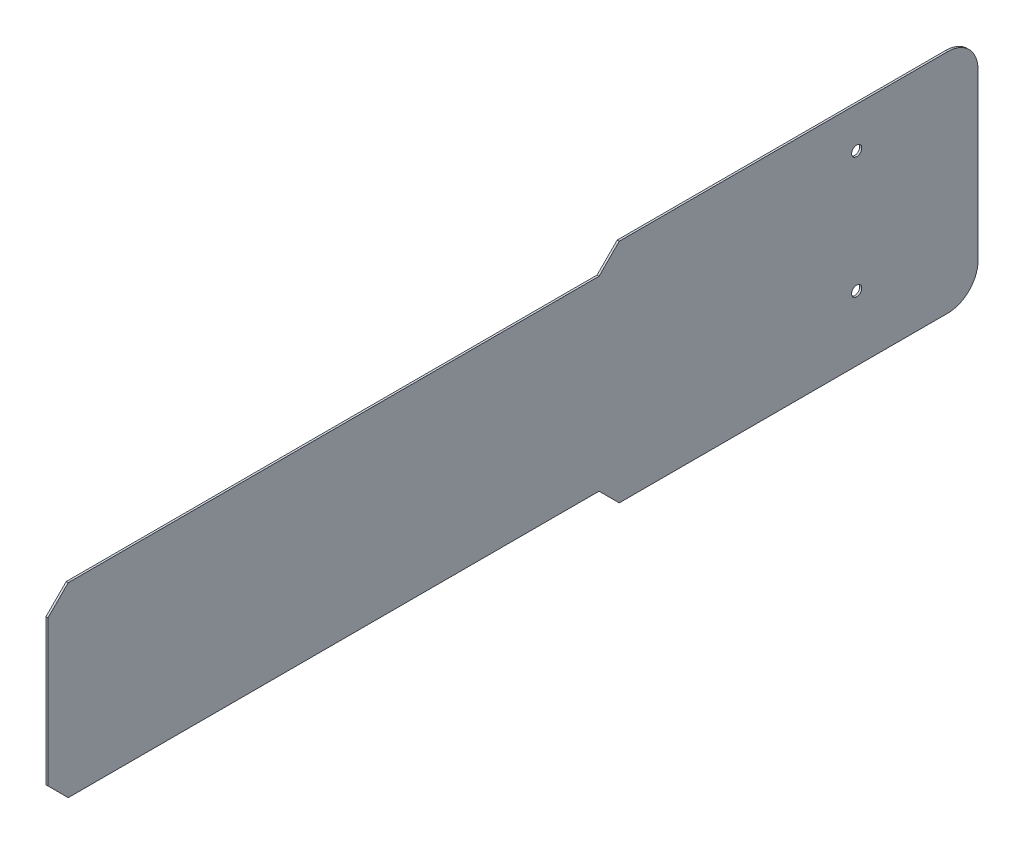
ISO-10303-21;
HEADER;
FILE_DESCRIPTION(('STEP AP214'),'2;1');
FILE_NAME('part.step','',(''),(''),'','','');
FILE_SCHEMA(('AUTOMOTIVE_DESIGN { 1 0 10303 214 1 1 1 1 }'));
ENDSEC;
DATA;
#1=APPLICATION_CONTEXT('core data for automotive mechanical design processes');
#2=APPLICATION_PROTOCOL_DEFINITION('international standard','automotive_design',2000,#1);
#3=PRODUCT_CONTEXT('',#1,'mechanical');
#4=PRODUCT('Part','Part','',(#3));
#5=PRODUCT_RELATED_PRODUCT_CATEGORY('part','',(#4));
#6=PRODUCT_DEFINITION_FORMATION('','',#4);
#7=PRODUCT_DEFINITION_CONTEXT('part definition',#1,'design');
#8=PRODUCT_DEFINITION('design','',#6,#7);
#9=PRODUCT_DEFINITION_SHAPE('','',#8);
#10=(LENGTH_UNIT() NAMED_UNIT(*) SI_UNIT(.MILLI.,.METRE.));
#11=(NAMED_UNIT(*) PLANE_ANGLE_UNIT() SI_UNIT($,.RADIAN.));
#12=(NAMED_UNIT(*) SI_UNIT($,.STERADIAN.) SOLID_ANGLE_UNIT());
#13=UNCERTAINTY_MEASURE_WITH_UNIT(LENGTH_MEASURE(1.E-05),#10,'distance_accuracy_value','');
#14=(GEOMETRIC_REPRESENTATION_CONTEXT(3) GLOBAL_UNCERTAINTY_ASSIGNED_CONTEXT((#13)) GLOBAL_UNIT_ASSIGNED_CONTEXT((#10,
#11,#12)) REPRESENTATION_CONTEXT('',''));
#15=CARTESIAN_POINT('',(0.,0.,0.));
#16=DIRECTION('',(0.,0.,1.));
#17=DIRECTION('',(1.,0.,0.));
#18=AXIS2_PLACEMENT_3D('',#15,#16,#17);
#19=CARTESIAN_POINT('',(-0.2,-35.603076923077,-25.6615384615385));
#20=DIRECTION('',(1.,0.,0.));
#21=DIRECTION('',(0.,0.,-1.));
#22=AXIS2_PLACEMENT_3D('',#19,#20,#21);
#23=CYLINDRICAL_SURFACE('',#22,3.);
#24=DIRECTION('',(1.,0.,0.));
#25=VECTOR('',#24,1.);
#26=CARTESIAN_POINT('',(-0.2,-35.603076923077,-28.6615384615385));
#27=LINE('',#26,#25);
#28=CARTESIAN_POINT('',(-0.2,-35.603076923077,-28.6615384615385));
#29=VERTEX_POINT('',#28);
#30=CARTESIAN_POINT('',(0.,-35.603076923077,-28.6615384615385));
#31=VERTEX_POINT('',#30);
#32=EDGE_CURVE('E192',#29,#31,#27,.T.);
#33=ORIENTED_EDGE('',*,*,#32,.F.);
#34=CARTESIAN_POINT('',(-0.2,-35.603076923077,-25.6615384615385));
#35=DIRECTION('',(1.,0.,0.));
#36=DIRECTION('',(0.,0.,-1.));
#37=AXIS2_PLACEMENT_3D('',#34,#35,#36);
#38=CIRCLE('',#37,3.);
#39=CARTESIAN_POINT('',(-0.2,-32.603076923077,-25.6615384615385));
#40=VERTEX_POINT('',#39);
#41=EDGE_CURVE('E42',#40,#29,#38,.F.);
#42=ORIENTED_EDGE('',*,*,#41,.F.);
#43=DIRECTION('',(1.,0.,0.));
#44=VECTOR('',#43,1.);
#45=CARTESIAN_POINT('',(-0.2,-32.603076923077,-25.6615384615385));
#46=LINE('',#45,#44);
#47=CARTESIAN_POINT('',(0.,-32.603076923077,-25.6615384615385));
#48=VERTEX_POINT('',#47);
#49=EDGE_CURVE('E195',#48,#40,#46,.F.);
#50=ORIENTED_EDGE('',*,*,#49,.F.);
#51=CARTESIAN_POINT('',(0.,-35.603076923077,-25.6615384615385));
#52=DIRECTION('',(1.,0.,0.));
#53=DIRECTION('',(0.,0.,-1.));
#54=AXIS2_PLACEMENT_3D('',#51,#52,#53);
#55=CIRCLE('',#54,3.);
#56=EDGE_CURVE('E11',#31,#48,#55,.T.);
#57=ORIENTED_EDGE('',*,*,#56,.F.);
#58=EDGE_LOOP('',(#33,#42,#50,#57));
#59=FACE_BOUND('',#58,.T.);
#60=ADVANCED_FACE('F34',(#59),#23,.T.);
#61=CARTESIAN_POINT('',(-0.2,-52.0230769230769,-25.6615384615385));
#62=DIRECTION('',(1.,0.,0.));
#63=DIRECTION('',(0.,0.,-1.));
#64=AXIS2_PLACEMENT_3D('',#61,#62,#63);
#65=CYLINDRICAL_SURFACE('',#64,3.);
#66=DIRECTION('',(-1.,0.,0.));
#67=VECTOR('',#66,1.);
#68=CARTESIAN_POINT('',(-0.2,-52.0230769230769,-28.6615384615385));
#69=LINE('',#68,#67);
#70=CARTESIAN_POINT('',(0.,-52.0230769230769,-28.6615384615385));
#71=VERTEX_POINT('',#70);
#72=CARTESIAN_POINT('',(-0.2,-52.0230769230769,-28.6615384615385));
#73=VERTEX_POINT('',#72);
#74=EDGE_CURVE('E174',#71,#73,#69,.T.);
#75=ORIENTED_EDGE('',*,*,#74,.F.);
#76=CARTESIAN_POINT('',(0.,-52.0230769230769,-25.6615384615385));
#77=DIRECTION('',(1.,0.,0.));
#78=DIRECTION('',(0.,0.,-1.));
#79=AXIS2_PLACEMENT_3D('',#76,#77,#78);
#80=CIRCLE('',#79,3.);
#81=CARTESIAN_POINT('',(0.,-55.0230769230769,-25.6615384615385));
#82=VERTEX_POINT('',#81);
#83=EDGE_CURVE('E188',#82,#71,#80,.T.);
#84=ORIENTED_EDGE('',*,*,#83,.F.);
#85=DIRECTION('',(-1.,0.,0.));
#86=VECTOR('',#85,1.);
#87=CARTESIAN_POINT('',(-0.2,-55.0230769230769,-25.6615384615385));
#88=LINE('',#87,#86);
#89=CARTESIAN_POINT('',(-0.2,-55.0230769230769,-25.6615384615385));
#90=VERTEX_POINT('',#89);
#91=EDGE_CURVE('E185',#90,#82,#88,.F.);
#92=ORIENTED_EDGE('',*,*,#91,.F.);
#93=CARTESIAN_POINT('',(-0.2,-52.0230769230769,-25.6615384615385));
#94=DIRECTION('',(1.,0.,0.));
#95=DIRECTION('',(0.,0.,-1.));
#96=AXIS2_PLACEMENT_3D('',#93,#94,#95);
#97=CIRCLE('',#96,3.);
#98=EDGE_CURVE('E190',#73,#90,#97,.F.);
#99=ORIENTED_EDGE('',*,*,#98,.F.);
#100=EDGE_LOOP('',(#75,#84,#92,#99));
#101=FACE_BOUND('',#100,.T.);
#102=ADVANCED_FACE('F210',(#101),#65,.T.);
#103=CARTESIAN_POINT('',(-0.2,-55.0230769230769,-28.6615384615385));
#104=DIRECTION('',(0.,0.,-1.));
#105=DIRECTION('',(-1.,0.,0.));
#106=AXIS2_PLACEMENT_3D('',#103,#104,#105);
#107=PLANE('',#106);
#108=DIRECTION('',(0.,1.,0.));
#109=VECTOR('',#108,1.);
#110=CARTESIAN_POINT('',(-0.2,-55.0230769230769,-28.6615384615385));
#111=LINE('',#110,#109);
#112=EDGE_CURVE('E161',#73,#29,#111,.T.);
#113=ORIENTED_EDGE('',*,*,#112,.T.);
#114=ORIENTED_EDGE('',*,*,#32,.T.);
#115=DIRECTION('',(0.,1.,0.));
#116=VECTOR('',#115,1.);
#117=CARTESIAN_POINT('',(0.,-55.0230769230769,-28.6615384615385));
#118=LINE('',#117,#116);
#119=EDGE_CURVE('E160',#71,#31,#118,.T.);
#120=ORIENTED_EDGE('',*,*,#119,.F.);
#121=ORIENTED_EDGE('',*,*,#74,.T.);
#122=EDGE_LOOP('',(#113,#114,#120,#121));
#123=FACE_BOUND('',#122,.T.);
#124=ADVANCED_FACE('F207',(#123),#107,.T.);
#125=CARTESIAN_POINT('',(-0.2,-55.0230769230769,-28.6615384615385));
#126=DIRECTION('',(0.,1.,0.));
#127=DIRECTION('',(0.,0.,1.));
#128=AXIS2_PLACEMENT_3D('',#125,#126,#127);
#129=PLANE('',#128);
#130=DIRECTION('',(0.,0.,1.));
#131=VECTOR('',#130,1.);
#132=CARTESIAN_POINT('',(0.,-55.0230769230769,-28.6615384615385));
#133=LINE('',#132,#131);
#134=CARTESIAN_POINT('',(0.,-55.0230769230769,6.82846153846155));
#135=VERTEX_POINT('',#134);
#136=EDGE_CURVE('E165',#82,#135,#133,.T.);
#137=ORIENTED_EDGE('',*,*,#136,.T.);
#138=DIRECTION('',(-1.,0.,0.));
#139=VECTOR('',#138,1.);
#140=CARTESIAN_POINT('',(0.,-55.0230769230769,6.82846153846155));
#141=LINE('',#140,#139);
#142=CARTESIAN_POINT('',(-0.200000000000003,-55.0230769230769,6.82846153846155));
#143=VERTEX_POINT('',#142);
#144=EDGE_CURVE('E220',#135,#143,#141,.T.);
#145=ORIENTED_EDGE('',*,*,#144,.T.);
#146=DIRECTION('',(0.,0.,1.));
#147=VECTOR('',#146,1.);
#148=CARTESIAN_POINT('',(-0.2,-55.0230769230769,-28.6615384615385));
#149=LINE('',#148,#147);
#150=EDGE_CURVE('E171',#90,#143,#149,.T.);
#151=ORIENTED_EDGE('',*,*,#150,.F.);
#152=ORIENTED_EDGE('',*,*,#91,.T.);
#153=EDGE_LOOP('',(#137,#145,#151,#152));
#154=FACE_BOUND('',#153,.T.);
#155=ADVANCED_FACE('F218',(#154),#129,.F.);
#156=CARTESIAN_POINT('',(-0.2,-55.0230769230769,63.3384615384615));
#157=DIRECTION('',(0.,0.,-1.));
#158=DIRECTION('',(-1.,0.,0.));
#159=AXIS2_PLACEMENT_3D('',#156,#157,#158);
#160=PLANE('',#159);
#161=DIRECTION('',(0.,1.,0.));
#162=VECTOR('',#161,1.);
#163=CARTESIAN_POINT('',(0.,-55.0230769230769,63.3384615384615));
#164=LINE('',#163,#162);
#165=CARTESIAN_POINT('',(0.,-51.0230769230769,63.3384615384615));
#166=VERTEX_POINT('',#165);
#167=CARTESIAN_POINT('',(0.,-36.603076923077,63.3384615384615));
#168=VERTEX_POINT('',#167);
#169=EDGE_CURVE('E178',#166,#168,#164,.T.);
#170=ORIENTED_EDGE('',*,*,#169,.T.);
#171=DIRECTION('',(-1.,0.,0.));
#172=VECTOR('',#171,1.);
#173=CARTESIAN_POINT('',(0.,-36.603076923077,63.3384615384615));
#174=LINE('',#173,#172);
#175=CARTESIAN_POINT('',(-0.200000000000002,-36.603076923077,63.3384615384615));
#176=VERTEX_POINT('',#175);
#177=EDGE_CURVE('E231',#168,#176,#174,.T.);
#178=ORIENTED_EDGE('',*,*,#177,.T.);
#179=DIRECTION('',(0.,1.,0.));
#180=VECTOR('',#179,1.);
#181=CARTESIAN_POINT('',(-0.2,-55.0230769230769,63.3384615384615));
#182=LINE('',#181,#180);
#183=CARTESIAN_POINT('',(-0.200000000000003,-51.0230769230769,63.3384615384615));
#184=VERTEX_POINT('',#183);
#185=EDGE_CURVE('E168',#184,#176,#182,.T.);
#186=ORIENTED_EDGE('',*,*,#185,.F.);
#187=DIRECTION('',(-1.,0.,0.));
#188=VECTOR('',#187,1.);
#189=CARTESIAN_POINT('',(0.,-51.0230769230769,63.3384615384615));
#190=LINE('',#189,#188);
#191=EDGE_CURVE('E150',#166,#184,#190,.T.);
#192=ORIENTED_EDGE('',*,*,#191,.F.);
#193=EDGE_LOOP('',(#170,#178,#186,#192));
#194=FACE_BOUND('',#193,.T.);
#195=ADVANCED_FACE('F246',(#194),#160,.F.);
#196=CARTESIAN_POINT('',(-0.2,-32.603076923077,-28.6615384615385));
#197=DIRECTION('',(0.,1.,0.));
#198=DIRECTION('',(0.,0.,1.));
#199=AXIS2_PLACEMENT_3D('',#196,#197,#198);
#200=PLANE('',#199);
#201=DIRECTION('',(-1.,0.,0.));
#202=VECTOR('',#201,1.);
#203=CARTESIAN_POINT('',(0.,-32.6030769230769,6.82846153846153));
#204=LINE('',#203,#202);
#205=CARTESIAN_POINT('',(0.,-32.6030769230769,6.82846153846153));
#206=VERTEX_POINT('',#205);
#207=CARTESIAN_POINT('',(-0.200000000000002,-32.6030769230769,6.82846153846153));
#208=VERTEX_POINT('',#207);
#209=EDGE_CURVE('E141',#206,#208,#204,.T.);
#210=ORIENTED_EDGE('',*,*,#209,.F.);
#211=DIRECTION('',(0.,0.,1.));
#212=VECTOR('',#211,1.);
#213=CARTESIAN_POINT('',(0.,-32.603076923077,-28.6615384615385));
#214=LINE('',#213,#212);
#215=EDGE_CURVE('E140',#48,#206,#214,.T.);
#216=ORIENTED_EDGE('',*,*,#215,.F.);
#217=ORIENTED_EDGE('',*,*,#49,.T.);
#218=DIRECTION('',(0.,0.,1.));
#219=VECTOR('',#218,1.);
#220=CARTESIAN_POINT('',(-0.2,-32.603076923077,-28.6615384615385));
#221=LINE('',#220,#219);
#222=EDGE_CURVE('E164',#40,#208,#221,.T.);
#223=ORIENTED_EDGE('',*,*,#222,.T.);
#224=EDGE_LOOP('',(#210,#216,#217,#223));
#225=FACE_BOUND('',#224,.T.);
#226=ADVANCED_FACE('F252',(#225),#200,.T.);
#227=CARTESIAN_POINT('',(-0.2,0.,0.));
#228=DIRECTION('',(1.,0.,0.));
#229=DIRECTION('',(0.,0.,-1.));
#230=AXIS2_PLACEMENT_3D('',#227,#228,#229);
#231=PLANE('',#230);
#232=CARTESIAN_POINT('',(-0.200000000000002,-36.603076923077,-16.6615384615385));
#233=DIRECTION('',(-1.,0.,0.));
#234=DIRECTION('',(0.,-1.,0.));
#235=AXIS2_PLACEMENT_3D('',#232,#233,#234);
#236=CIRCLE('',#235,0.499999999999999);
#237=CARTESIAN_POINT('',(-0.200000000000002,-37.103076923077,-16.6615384615385));
#238=VERTEX_POINT('',#237);
#239=EDGE_CURVE('E260',#238,#238,#236,.T.);
#240=ORIENTED_EDGE('',*,*,#239,.F.);
#241=EDGE_LOOP('',(#240));
#242=FACE_BOUND('',#241,.T.);
#243=CARTESIAN_POINT('',(-0.200000000000003,-48.603076923077,-16.6615384615385));
#244=DIRECTION('',(-1.,0.,0.));
#245=DIRECTION('',(0.,-1.,0.));
#246=AXIS2_PLACEMENT_3D('',#243,#244,#245);
#247=CIRCLE('',#246,0.499999999999999);
#248=CARTESIAN_POINT('',(-0.200000000000003,-49.103076923077,-16.6615384615385));
#249=VERTEX_POINT('',#248);
#250=EDGE_CURVE('E256',#249,#249,#247,.T.);
#251=ORIENTED_EDGE('',*,*,#250,.F.);
#252=EDGE_LOOP('',(#251));
#253=FACE_BOUND('',#252,.T.);
#254=DIRECTION('',(0.,0.,1.));
#255=VECTOR('',#254,1.);
#256=CARTESIAN_POINT('',(-0.200000000000002,-34.603076923077,8.82846153846154));
#257=LINE('',#256,#255);
#258=CARTESIAN_POINT('',(-0.200000000000002,-34.603076923077,8.82846153846154));
#259=VERTEX_POINT('',#258);
#260=CARTESIAN_POINT('',(-0.200000000000002,-34.603076923077,61.3384615384615));
#261=VERTEX_POINT('',#260);
#262=EDGE_CURVE('E145',#259,#261,#257,.T.);
#263=ORIENTED_EDGE('',*,*,#262,.F.);
#264=DIRECTION('',(0.,-0.70710678118655,0.707106781186545));
#265=VECTOR('',#264,1.);
#266=CARTESIAN_POINT('',(-0.200000000000002,-32.6030769230769,6.82846153846153));
#267=LINE('',#266,#265);
#268=EDGE_CURVE('E127',#208,#259,#267,.T.);
#269=ORIENTED_EDGE('',*,*,#268,.F.);
#270=ORIENTED_EDGE('',*,*,#222,.F.);
#271=ORIENTED_EDGE('',*,*,#41,.T.);
#272=ORIENTED_EDGE('',*,*,#112,.F.);
#273=ORIENTED_EDGE('',*,*,#98,.T.);
#274=ORIENTED_EDGE('',*,*,#150,.T.);
#275=DIRECTION('',(0.,-0.707106781186548,-0.707106781186547));
#276=VECTOR('',#275,1.);
#277=CARTESIAN_POINT('',(-0.200000000000003,-55.0230769230769,6.82846153846155));
#278=LINE('',#277,#276);
#279=CARTESIAN_POINT('',(-0.200000000000003,-53.0230769230769,8.82846153846155));
#280=VERTEX_POINT('',#279);
#281=EDGE_CURVE('E215',#280,#143,#278,.T.);
#282=ORIENTED_EDGE('',*,*,#281,.F.);
#283=DIRECTION('',(0.,0.,-1.));
#284=VECTOR('',#283,1.);
#285=CARTESIAN_POINT('',(-0.200000000000003,-53.0230769230769,8.82846153846155));
#286=LINE('',#285,#284);
#287=CARTESIAN_POINT('',(-0.200000000000003,-53.0230769230769,61.3384615384615));
#288=VERTEX_POINT('',#287);
#289=EDGE_CURVE('E132',#288,#280,#286,.T.);
#290=ORIENTED_EDGE('',*,*,#289,.F.);
#291=DIRECTION('',(0.,-0.707106781186547,-0.707106781186547));
#292=VECTOR('',#291,1.);
#293=CARTESIAN_POINT('',(-0.200000000000003,-53.0230769230769,61.3384615384615));
#294=LINE('',#293,#292);
#295=EDGE_CURVE('E57',#184,#288,#294,.T.);
#296=ORIENTED_EDGE('',*,*,#295,.F.);
#297=ORIENTED_EDGE('',*,*,#185,.T.);
#298=DIRECTION('',(0.,-0.707106781186547,0.707106781186547));
#299=VECTOR('',#298,1.);
#300=CARTESIAN_POINT('',(-0.200000000000002,-34.603076923077,61.3384615384615));
#301=LINE('',#300,#299);
#302=EDGE_CURVE('E223',#261,#176,#301,.T.);
#303=ORIENTED_EDGE('',*,*,#302,.F.);
#304=EDGE_LOOP('',(#263,#269,#270,#271,#272,#273,#274,#282,#290,#296,#297,#303));
#305=FACE_BOUND('',#304,.T.);
#306=ADVANCED_FACE('F202',(#242,#253,#305),#231,.F.);
#307=CARTESIAN_POINT('',(0.,0.,0.));
#308=DIRECTION('',(1.,0.,0.));
#309=DIRECTION('',(0.,0.,-1.));
#310=AXIS2_PLACEMENT_3D('',#307,#308,#309);
#311=PLANE('',#310);
#312=CARTESIAN_POINT('',(0.,-36.603076923077,-16.6615384615385));
#313=DIRECTION('',(-1.,0.,0.));
#314=DIRECTION('',(0.,-1.,0.));
#315=AXIS2_PLACEMENT_3D('',#312,#313,#314);
#316=CIRCLE('',#315,0.499999999999999);
#317=CARTESIAN_POINT('',(0.,-37.103076923077,-16.6615384615385));
#318=VERTEX_POINT('',#317);
#319=EDGE_CURVE('E259',#318,#318,#316,.T.);
#320=ORIENTED_EDGE('',*,*,#319,.T.);
#321=EDGE_LOOP('',(#320));
#322=FACE_BOUND('',#321,.T.);
#323=CARTESIAN_POINT('',(0.,-48.603076923077,-16.6615384615385));
#324=DIRECTION('',(1.,0.,0.));
#325=DIRECTION('',(0.,0.,-1.));
#326=AXIS2_PLACEMENT_3D('',#323,#324,#325);
#327=CIRCLE('',#326,0.499999999999999);
#328=CARTESIAN_POINT('',(0.,-48.603076923077,-17.1615384615385));
#329=VERTEX_POINT('',#328);
#330=EDGE_CURVE('E37',#329,#329,#327,.T.);
#331=ORIENTED_EDGE('',*,*,#330,.F.);
#332=EDGE_LOOP('',(#331));
#333=FACE_BOUND('',#332,.T.);
#334=DIRECTION('',(0.,-0.70710678118655,0.707106781186545));
#335=VECTOR('',#334,1.);
#336=CARTESIAN_POINT('',(0.,-32.6030769230769,6.82846153846153));
#337=LINE('',#336,#335);
#338=CARTESIAN_POINT('',(0.,-34.603076923077,8.82846153846154));
#339=VERTEX_POINT('',#338);
#340=EDGE_CURVE('E124',#206,#339,#337,.T.);
#341=ORIENTED_EDGE('',*,*,#340,.T.);
#342=DIRECTION('',(0.,0.,1.));
#343=VECTOR('',#342,1.);
#344=CARTESIAN_POINT('',(0.,-34.603076923077,8.82846153846154));
#345=LINE('',#344,#343);
#346=CARTESIAN_POINT('',(0.,-34.603076923077,61.3384615384615));
#347=VERTEX_POINT('',#346);
#348=EDGE_CURVE('E133',#339,#347,#345,.T.);
#349=ORIENTED_EDGE('',*,*,#348,.T.);
#350=DIRECTION('',(0.,-0.707106781186547,0.707106781186547));
#351=VECTOR('',#350,1.);
#352=CARTESIAN_POINT('',(0.,-34.603076923077,61.3384615384615));
#353=LINE('',#352,#351);
#354=EDGE_CURVE('E49',#347,#168,#353,.T.);
#355=ORIENTED_EDGE('',*,*,#354,.T.);
#356=ORIENTED_EDGE('',*,*,#169,.F.);
#357=DIRECTION('',(0.,-0.707106781186547,-0.707106781186547));
#358=VECTOR('',#357,1.);
#359=CARTESIAN_POINT('',(0.,-53.0230769230769,61.3384615384615));
#360=LINE('',#359,#358);
#361=CARTESIAN_POINT('',(0.,-53.0230769230769,61.3384615384615));
#362=VERTEX_POINT('',#361);
#363=EDGE_CURVE('E235',#166,#362,#360,.T.);
#364=ORIENTED_EDGE('',*,*,#363,.T.);
#365=DIRECTION('',(0.,0.,-1.));
#366=VECTOR('',#365,1.);
#367=CARTESIAN_POINT('',(0.,-53.0230769230769,8.82846153846155));
#368=LINE('',#367,#366);
#369=CARTESIAN_POINT('',(0.,-53.0230769230769,8.82846153846155));
#370=VERTEX_POINT('',#369);
#371=EDGE_CURVE('E153',#362,#370,#368,.T.);
#372=ORIENTED_EDGE('',*,*,#371,.T.);
#373=DIRECTION('',(0.,-0.707106781186548,-0.707106781186547));
#374=VECTOR('',#373,1.);
#375=CARTESIAN_POINT('',(0.,-55.0230769230769,6.82846153846155));
#376=LINE('',#375,#374);
#377=EDGE_CURVE('E224',#370,#135,#376,.T.);
#378=ORIENTED_EDGE('',*,*,#377,.T.);
#379=ORIENTED_EDGE('',*,*,#136,.F.);
#380=ORIENTED_EDGE('',*,*,#83,.T.);
#381=ORIENTED_EDGE('',*,*,#119,.T.);
#382=ORIENTED_EDGE('',*,*,#56,.T.);
#383=ORIENTED_EDGE('',*,*,#215,.T.);
#384=EDGE_LOOP('',(#341,#349,#355,#356,#364,#372,#378,#379,#380,#381,#382,#383));
#385=FACE_BOUND('',#384,.T.);
#386=ADVANCED_FACE('F138',(#322,#333,#385),#311,.T.);
#387=CARTESIAN_POINT('',(0.,-53.0230769230769,8.82846153846155));
#388=DIRECTION('',(0.,1.,0.));
#389=DIRECTION('',(-1.,0.,0.));
#390=AXIS2_PLACEMENT_3D('',#387,#388,#389);
#391=PLANE('',#390);
#392=ORIENTED_EDGE('',*,*,#371,.F.);
#393=DIRECTION('',(-1.,0.,0.));
#394=VECTOR('',#393,1.);
#395=CARTESIAN_POINT('',(0.,-53.0230769230769,61.3384615384615));
#396=LINE('',#395,#394);
#397=EDGE_CURVE('E147',#362,#288,#396,.T.);
#398=ORIENTED_EDGE('',*,*,#397,.T.);
#399=ORIENTED_EDGE('',*,*,#289,.T.);
#400=DIRECTION('',(-1.,0.,0.));
#401=VECTOR('',#400,1.);
#402=CARTESIAN_POINT('',(0.,-53.0230769230769,8.82846153846155));
#403=LINE('',#402,#401);
#404=EDGE_CURVE('E156',#370,#280,#403,.T.);
#405=ORIENTED_EDGE('',*,*,#404,.F.);
#406=EDGE_LOOP('',(#392,#398,#399,#405));
#407=FACE_BOUND('',#406,.T.);
#408=ADVANCED_FACE('F249',(#407),#391,.F.);
#409=CARTESIAN_POINT('',(0.,-34.603076923077,8.82846153846154));
#410=DIRECTION('',(0.,-1.,0.));
#411=DIRECTION('',(0.,0.,-1.));
#412=AXIS2_PLACEMENT_3D('',#409,#410,#411);
#413=PLANE('',#412);
#414=ORIENTED_EDGE('',*,*,#262,.T.);
#415=DIRECTION('',(-1.,0.,0.));
#416=VECTOR('',#415,1.);
#417=CARTESIAN_POINT('',(0.,-34.603076923077,61.3384615384615));
#418=LINE('',#417,#416);
#419=EDGE_CURVE('E144',#347,#261,#418,.T.);
#420=ORIENTED_EDGE('',*,*,#419,.F.);
#421=ORIENTED_EDGE('',*,*,#348,.F.);
#422=DIRECTION('',(-1.,0.,0.));
#423=VECTOR('',#422,1.);
#424=CARTESIAN_POINT('',(0.,-34.603076923077,8.82846153846154));
#425=LINE('',#424,#423);
#426=EDGE_CURVE('E121',#339,#259,#425,.T.);
#427=ORIENTED_EDGE('',*,*,#426,.T.);
#428=EDGE_LOOP('',(#414,#420,#421,#427));
#429=FACE_BOUND('',#428,.T.);
#430=ADVANCED_FACE('F143',(#429),#413,.F.);
#431=CARTESIAN_POINT('',(0.,-53.0230769230769,61.3384615384615));
#432=DIRECTION('',(0.,0.707106781186548,-0.707106781186548));
#433=DIRECTION('',(0.,0.707106781186548,0.707106781186548));
#434=AXIS2_PLACEMENT_3D('',#431,#432,#433);
#435=PLANE('',#434);
#436=ORIENTED_EDGE('',*,*,#295,.T.);
#437=ORIENTED_EDGE('',*,*,#397,.F.);
#438=ORIENTED_EDGE('',*,*,#363,.F.);
#439=ORIENTED_EDGE('',*,*,#191,.T.);
#440=EDGE_LOOP('',(#436,#437,#438,#439));
#441=FACE_BOUND('',#440,.T.);
#442=ADVANCED_FACE('F241',(#441),#435,.F.);
#443=CARTESIAN_POINT('',(0.,-34.603076923077,61.3384615384615));
#444=DIRECTION('',(0.,-0.707106781186548,-0.707106781186548));
#445=DIRECTION('',(0.,0.707106781186548,-0.707106781186548));
#446=AXIS2_PLACEMENT_3D('',#443,#444,#445);
#447=PLANE('',#446);
#448=ORIENTED_EDGE('',*,*,#302,.T.);
#449=ORIENTED_EDGE('',*,*,#177,.F.);
#450=ORIENTED_EDGE('',*,*,#354,.F.);
#451=ORIENTED_EDGE('',*,*,#419,.T.);
#452=EDGE_LOOP('',(#448,#449,#450,#451));
#453=FACE_BOUND('',#452,.T.);
#454=ADVANCED_FACE('F247',(#453),#447,.F.);
#455=CARTESIAN_POINT('',(0.,-55.0230769230769,6.82846153846155));
#456=DIRECTION('',(0.,0.707106781186547,-0.707106781186548));
#457=DIRECTION('',(0.,0.707106781186548,0.707106781186547));
#458=AXIS2_PLACEMENT_3D('',#455,#456,#457);
#459=PLANE('',#458);
#460=ORIENTED_EDGE('',*,*,#281,.T.);
#461=ORIENTED_EDGE('',*,*,#144,.F.);
#462=ORIENTED_EDGE('',*,*,#377,.F.);
#463=ORIENTED_EDGE('',*,*,#404,.T.);
#464=EDGE_LOOP('',(#460,#461,#462,#463));
#465=FACE_BOUND('',#464,.T.);
#466=ADVANCED_FACE('F250',(#465),#459,.F.);
#467=CARTESIAN_POINT('',(0.,-32.6030769230769,6.82846153846153));
#468=DIRECTION('',(0.,-0.707106781186545,-0.70710678118655));
#469=DIRECTION('',(0.,0.70710678118655,-0.707106781186545));
#470=AXIS2_PLACEMENT_3D('',#467,#468,#469);
#471=PLANE('',#470);
#472=ORIENTED_EDGE('',*,*,#268,.T.);
#473=ORIENTED_EDGE('',*,*,#426,.F.);
#474=ORIENTED_EDGE('',*,*,#340,.F.);
#475=ORIENTED_EDGE('',*,*,#209,.T.);
#476=EDGE_LOOP('',(#472,#473,#474,#475));
#477=FACE_BOUND('',#476,.T.);
#478=ADVANCED_FACE('F123',(#477),#471,.F.);
#479=CARTESIAN_POINT('',(9.8,-48.603076923077,-16.6615384615385));
#480=DIRECTION('',(-1.,0.,0.));
#481=DIRECTION('',(0.,-1.,0.));
#482=AXIS2_PLACEMENT_3D('',#479,#480,#481);
#483=CYLINDRICAL_SURFACE('',#482,0.499999999999999);
#484=ORIENTED_EDGE('',*,*,#330,.T.);
#485=EDGE_LOOP('',(#484));
#486=FACE_BOUND('',#485,.T.);
#487=ORIENTED_EDGE('',*,*,#250,.T.);
#488=EDGE_LOOP('',(#487));
#489=FACE_BOUND('',#488,.T.);
#490=ADVANCED_FACE('F271',(#486,#489),#483,.F.);
#491=CARTESIAN_POINT('',(0.,-36.603076923077,-16.6615384615385));
#492=DIRECTION('',(-1.,0.,0.));
#493=DIRECTION('',(0.,-1.,0.));
#494=AXIS2_PLACEMENT_3D('',#491,#492,#493);
#495=CYLINDRICAL_SURFACE('',#494,0.499999999999999);
#496=ORIENTED_EDGE('',*,*,#319,.F.);
#497=EDGE_LOOP('',(#496));
#498=FACE_BOUND('',#497,.T.);
#499=ORIENTED_EDGE('',*,*,#239,.T.);
#500=EDGE_LOOP('',(#499));
#501=FACE_BOUND('',#500,.T.);
#502=ADVANCED_FACE('F268',(#498,#501),#495,.F.);
#503=CLOSED_SHELL('',(#60,#102,#124,#155,#195,#226,#306,#386,#408,#430,#442,#454,#466,#478,#490,#502));
#504=MANIFOLD_SOLID_BREP('B2',#503);
#505=ADVANCED_BREP_SHAPE_REPRESENTATION('',(#18,#504),#14);
#506=SHAPE_DEFINITION_REPRESENTATION(#9,#505);
ENDSEC;
END-ISO-10303-21;
